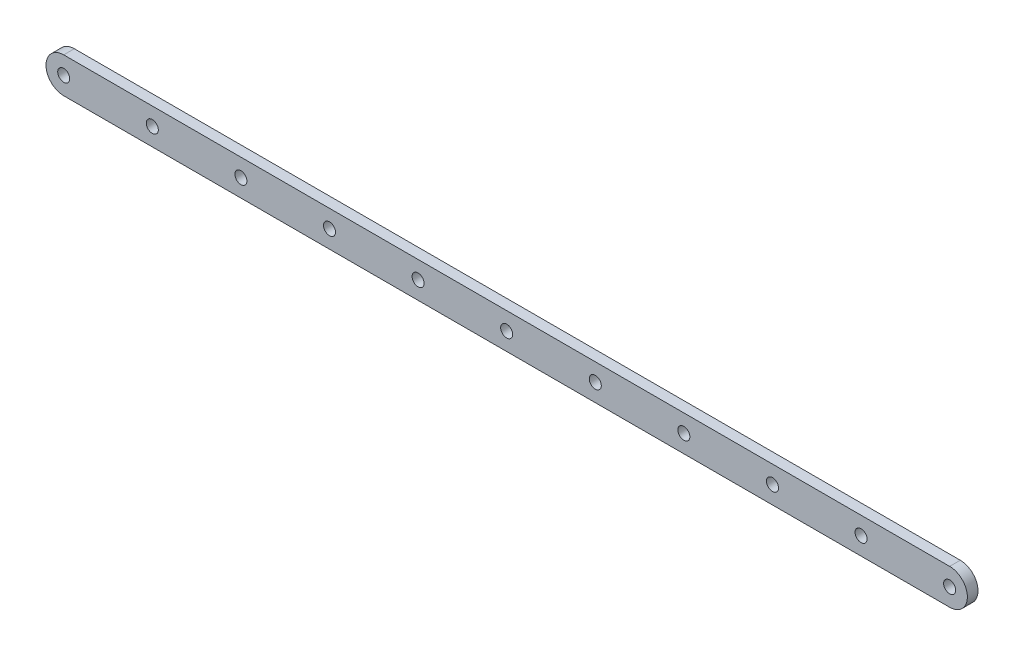
ISO-10303-21;
HEADER;
FILE_DESCRIPTION(('STEP AP214'),'2;1');
FILE_NAME('part.step','',(''),(''),'','','');
FILE_SCHEMA(('AUTOMOTIVE_DESIGN { 1 0 10303 214 1 1 1 1 }'));
ENDSEC;
DATA;
#1=APPLICATION_CONTEXT('core data for automotive mechanical design processes');
#2=APPLICATION_PROTOCOL_DEFINITION('international standard','automotive_design',2000,#1);
#3=PRODUCT_CONTEXT('',#1,'mechanical');
#4=PRODUCT('Part','Part','',(#3));
#5=PRODUCT_RELATED_PRODUCT_CATEGORY('part','',(#4));
#6=PRODUCT_DEFINITION_FORMATION('','',#4);
#7=PRODUCT_DEFINITION_CONTEXT('part definition',#1,'design');
#8=PRODUCT_DEFINITION('design','',#6,#7);
#9=PRODUCT_DEFINITION_SHAPE('','',#8);
#10=(LENGTH_UNIT() NAMED_UNIT(*) SI_UNIT(.MILLI.,.METRE.));
#11=(NAMED_UNIT(*) PLANE_ANGLE_UNIT() SI_UNIT($,.RADIAN.));
#12=(NAMED_UNIT(*) SI_UNIT($,.STERADIAN.) SOLID_ANGLE_UNIT());
#13=UNCERTAINTY_MEASURE_WITH_UNIT(LENGTH_MEASURE(1.E-05),#10,'distance_accuracy_value','');
#14=(GEOMETRIC_REPRESENTATION_CONTEXT(3) GLOBAL_UNCERTAINTY_ASSIGNED_CONTEXT((#13)) GLOBAL_UNIT_ASSIGNED_CONTEXT((#10,
#11,#12)) REPRESENTATION_CONTEXT('',''));
#15=CARTESIAN_POINT('',(0.,0.,0.));
#16=DIRECTION('',(0.,0.,1.));
#17=DIRECTION('',(1.,0.,0.));
#18=AXIS2_PLACEMENT_3D('',#15,#16,#17);
#19=CARTESIAN_POINT('',(0.,-5.,3.));
#20=DIRECTION('',(0.,-1.,0.));
#21=DIRECTION('',(1.,0.,0.));
#22=AXIS2_PLACEMENT_3D('',#19,#20,#21);
#23=PLANE('',#22);
#24=DIRECTION('',(-1.,0.,0.));
#25=VECTOR('',#24,1.);
#26=CARTESIAN_POINT('',(0.,-5.,0.));
#27=LINE('',#26,#25);
#28=CARTESIAN_POINT('',(250.,-5.,0.));
#29=VERTEX_POINT('',#28);
#30=CARTESIAN_POINT('',(0.,-5.,0.));
#31=VERTEX_POINT('',#30);
#32=EDGE_CURVE('E111',#29,#31,#27,.T.);
#33=ORIENTED_EDGE('',*,*,#32,.F.);
#34=DIRECTION('',(0.,0.,-1.));
#35=VECTOR('',#34,1.);
#36=CARTESIAN_POINT('',(250.,-5.,3.));
#37=LINE('',#36,#35);
#38=CARTESIAN_POINT('',(250.,-5.,3.));
#39=VERTEX_POINT('',#38);
#40=EDGE_CURVE('E11',#39,#29,#37,.T.);
#41=ORIENTED_EDGE('',*,*,#40,.F.);
#42=DIRECTION('',(-1.,0.,0.));
#43=VECTOR('',#42,1.);
#44=CARTESIAN_POINT('',(0.,-5.,3.));
#45=LINE('',#44,#43);
#46=CARTESIAN_POINT('',(0.,-5.,3.));
#47=VERTEX_POINT('',#46);
#48=EDGE_CURVE('E92',#39,#47,#45,.T.);
#49=ORIENTED_EDGE('',*,*,#48,.T.);
#50=DIRECTION('',(0.,0.,-1.));
#51=VECTOR('',#50,1.);
#52=CARTESIAN_POINT('',(0.,-5.,3.));
#53=LINE('',#52,#51);
#54=EDGE_CURVE('E82',#47,#31,#53,.T.);
#55=ORIENTED_EDGE('',*,*,#54,.T.);
#56=EDGE_LOOP('',(#33,#41,#49,#55));
#57=FACE_BOUND('',#56,.T.);
#58=ADVANCED_FACE('F43',(#57),#23,.T.);
#59=CARTESIAN_POINT('',(250.,0.,3.));
#60=DIRECTION('',(0.,0.,-1.));
#61=DIRECTION('',(-1.,0.,0.));
#62=AXIS2_PLACEMENT_3D('',#59,#60,#61);
#63=CYLINDRICAL_SURFACE('',#62,4.99999999999999);
#64=CARTESIAN_POINT('',(250.,0.,0.));
#65=DIRECTION('',(0.,0.,1.));
#66=DIRECTION('',(1.,0.,0.));
#67=AXIS2_PLACEMENT_3D('',#64,#65,#66);
#68=CIRCLE('',#67,4.99999999999999);
#69=CARTESIAN_POINT('',(250.,5.,0.));
#70=VERTEX_POINT('',#69);
#71=EDGE_CURVE('E99',#29,#70,#68,.T.);
#72=ORIENTED_EDGE('',*,*,#71,.T.);
#73=DIRECTION('',(0.,0.,-1.));
#74=VECTOR('',#73,1.);
#75=CARTESIAN_POINT('',(250.,5.,3.));
#76=LINE('',#75,#74);
#77=CARTESIAN_POINT('',(250.,5.,3.));
#78=VERTEX_POINT('',#77);
#79=EDGE_CURVE('E52',#78,#70,#76,.T.);
#80=ORIENTED_EDGE('',*,*,#79,.F.);
#81=CARTESIAN_POINT('',(250.,0.,3.));
#82=DIRECTION('',(0.,0.,1.));
#83=DIRECTION('',(1.,0.,0.));
#84=AXIS2_PLACEMENT_3D('',#81,#82,#83);
#85=CIRCLE('',#84,4.99999999999999);
#86=EDGE_CURVE('E87',#39,#78,#85,.T.);
#87=ORIENTED_EDGE('',*,*,#86,.F.);
#88=ORIENTED_EDGE('',*,*,#40,.T.);
#89=EDGE_LOOP('',(#72,#80,#87,#88));
#90=FACE_BOUND('',#89,.T.);
#91=ADVANCED_FACE('F97',(#90),#63,.T.);
#92=CARTESIAN_POINT('',(0.,5.,3.));
#93=DIRECTION('',(0.,1.,0.));
#94=DIRECTION('',(-1.,0.,0.));
#95=AXIS2_PLACEMENT_3D('',#92,#93,#94);
#96=PLANE('',#95);
#97=DIRECTION('',(1.,0.,0.));
#98=VECTOR('',#97,1.);
#99=CARTESIAN_POINT('',(0.,5.,0.));
#100=LINE('',#99,#98);
#101=CARTESIAN_POINT('',(0.,5.,0.));
#102=VERTEX_POINT('',#101);
#103=EDGE_CURVE('E118',#102,#70,#100,.T.);
#104=ORIENTED_EDGE('',*,*,#103,.F.);
#105=DIRECTION('',(0.,0.,-1.));
#106=VECTOR('',#105,1.);
#107=CARTESIAN_POINT('',(0.,5.,3.));
#108=LINE('',#107,#106);
#109=CARTESIAN_POINT('',(0.,5.,3.));
#110=VERTEX_POINT('',#109);
#111=EDGE_CURVE('E75',#110,#102,#108,.T.);
#112=ORIENTED_EDGE('',*,*,#111,.F.);
#113=DIRECTION('',(1.,0.,0.));
#114=VECTOR('',#113,1.);
#115=CARTESIAN_POINT('',(0.,5.,3.));
#116=LINE('',#115,#114);
#117=EDGE_CURVE('E91',#110,#78,#116,.T.);
#118=ORIENTED_EDGE('',*,*,#117,.T.);
#119=ORIENTED_EDGE('',*,*,#79,.T.);
#120=EDGE_LOOP('',(#104,#112,#118,#119));
#121=FACE_BOUND('',#120,.T.);
#122=ADVANCED_FACE('F104',(#121),#96,.T.);
#123=CARTESIAN_POINT('',(0.,0.,3.));
#124=DIRECTION('',(0.,0.,-1.));
#125=DIRECTION('',(-1.,0.,0.));
#126=AXIS2_PLACEMENT_3D('',#123,#124,#125);
#127=CYLINDRICAL_SURFACE('',#126,5.);
#128=CARTESIAN_POINT('',(0.,0.,0.));
#129=DIRECTION('',(0.,0.,1.));
#130=DIRECTION('',(1.,0.,0.));
#131=AXIS2_PLACEMENT_3D('',#128,#129,#130);
#132=CIRCLE('',#131,5.);
#133=EDGE_CURVE('E121',#102,#31,#132,.T.);
#134=ORIENTED_EDGE('',*,*,#133,.T.);
#135=ORIENTED_EDGE('',*,*,#54,.F.);
#136=CARTESIAN_POINT('',(0.,0.,3.));
#137=DIRECTION('',(0.,0.,1.));
#138=DIRECTION('',(1.,0.,0.));
#139=AXIS2_PLACEMENT_3D('',#136,#137,#138);
#140=CIRCLE('',#139,5.);
#141=EDGE_CURVE('E60',#110,#47,#140,.T.);
#142=ORIENTED_EDGE('',*,*,#141,.F.);
#143=ORIENTED_EDGE('',*,*,#111,.T.);
#144=EDGE_LOOP('',(#134,#135,#142,#143));
#145=FACE_BOUND('',#144,.T.);
#146=ADVANCED_FACE('F229',(#145),#127,.T.);
#147=CARTESIAN_POINT('',(0.,0.,3.));
#148=DIRECTION('',(0.,0.,1.));
#149=DIRECTION('',(1.,0.,0.));
#150=AXIS2_PLACEMENT_3D('',#147,#148,#149);
#151=PLANE('',#150);
#152=CARTESIAN_POINT('',(25.,0.,3.));
#153=DIRECTION('',(0.,0.,1.));
#154=DIRECTION('',(1.,0.,0.));
#155=AXIS2_PLACEMENT_3D('',#152,#153,#154);
#156=CIRCLE('',#155,1.7);
#157=CARTESIAN_POINT('',(26.7,0.,3.));
#158=VERTEX_POINT('',#157);
#159=EDGE_CURVE('E154',#158,#158,#156,.T.);
#160=ORIENTED_EDGE('',*,*,#159,.F.);
#161=EDGE_LOOP('',(#160));
#162=FACE_BOUND('',#161,.T.);
#163=CARTESIAN_POINT('',(175.,0.,3.));
#164=DIRECTION('',(0.,0.,1.));
#165=DIRECTION('',(1.,0.,0.));
#166=AXIS2_PLACEMENT_3D('',#163,#164,#165);
#167=CIRCLE('',#166,1.7);
#168=CARTESIAN_POINT('',(176.7,0.,3.));
#169=VERTEX_POINT('',#168);
#170=EDGE_CURVE('E187',#169,#169,#167,.T.);
#171=ORIENTED_EDGE('',*,*,#170,.F.);
#172=EDGE_LOOP('',(#171));
#173=FACE_BOUND('',#172,.T.);
#174=CARTESIAN_POINT('',(150.,0.,3.));
#175=DIRECTION('',(0.,0.,1.));
#176=DIRECTION('',(1.,0.,0.));
#177=AXIS2_PLACEMENT_3D('',#174,#175,#176);
#178=CIRCLE('',#177,1.7);
#179=CARTESIAN_POINT('',(151.7,0.,3.));
#180=VERTEX_POINT('',#179);
#181=EDGE_CURVE('E179',#180,#180,#178,.T.);
#182=ORIENTED_EDGE('',*,*,#181,.F.);
#183=EDGE_LOOP('',(#182));
#184=FACE_BOUND('',#183,.T.);
#185=CARTESIAN_POINT('',(225.,0.,3.));
#186=DIRECTION('',(0.,0.,1.));
#187=DIRECTION('',(1.,0.,0.));
#188=AXIS2_PLACEMENT_3D('',#185,#186,#187);
#189=CIRCLE('',#188,1.7);
#190=CARTESIAN_POINT('',(226.7,0.,3.));
#191=VERTEX_POINT('',#190);
#192=EDGE_CURVE('E203',#191,#191,#189,.T.);
#193=ORIENTED_EDGE('',*,*,#192,.F.);
#194=EDGE_LOOP('',(#193));
#195=FACE_BOUND('',#194,.T.);
#196=CARTESIAN_POINT('',(200.,0.,3.));
#197=DIRECTION('',(0.,0.,1.));
#198=DIRECTION('',(1.,0.,0.));
#199=AXIS2_PLACEMENT_3D('',#196,#197,#198);
#200=CIRCLE('',#199,1.7);
#201=CARTESIAN_POINT('',(201.7,0.,3.));
#202=VERTEX_POINT('',#201);
#203=EDGE_CURVE('E195',#202,#202,#200,.T.);
#204=ORIENTED_EDGE('',*,*,#203,.F.);
#205=EDGE_LOOP('',(#204));
#206=FACE_BOUND('',#205,.T.);
#207=CARTESIAN_POINT('',(75.,0.,3.));
#208=DIRECTION('',(0.,0.,1.));
#209=DIRECTION('',(1.,0.,0.));
#210=AXIS2_PLACEMENT_3D('',#207,#208,#209);
#211=CIRCLE('',#210,1.7);
#212=CARTESIAN_POINT('',(76.7,0.,3.));
#213=VERTEX_POINT('',#212);
#214=EDGE_CURVE('E155',#213,#213,#211,.T.);
#215=ORIENTED_EDGE('',*,*,#214,.F.);
#216=EDGE_LOOP('',(#215));
#217=FACE_BOUND('',#216,.T.);
#218=CARTESIAN_POINT('',(50.,0.,3.));
#219=DIRECTION('',(0.,0.,1.));
#220=DIRECTION('',(1.,0.,0.));
#221=AXIS2_PLACEMENT_3D('',#218,#219,#220);
#222=CIRCLE('',#221,1.7);
#223=CARTESIAN_POINT('',(51.7,0.,3.));
#224=VERTEX_POINT('',#223);
#225=EDGE_CURVE('E145',#224,#224,#222,.T.);
#226=ORIENTED_EDGE('',*,*,#225,.F.);
#227=EDGE_LOOP('',(#226));
#228=FACE_BOUND('',#227,.T.);
#229=CARTESIAN_POINT('',(125.,0.,3.));
#230=DIRECTION('',(0.,0.,1.));
#231=DIRECTION('',(1.,0.,0.));
#232=AXIS2_PLACEMENT_3D('',#229,#230,#231);
#233=CIRCLE('',#232,1.7);
#234=CARTESIAN_POINT('',(126.7,0.,3.));
#235=VERTEX_POINT('',#234);
#236=EDGE_CURVE('E171',#235,#235,#233,.T.);
#237=ORIENTED_EDGE('',*,*,#236,.F.);
#238=EDGE_LOOP('',(#237));
#239=FACE_BOUND('',#238,.T.);
#240=CARTESIAN_POINT('',(100.,0.,3.));
#241=DIRECTION('',(0.,0.,1.));
#242=DIRECTION('',(1.,0.,0.));
#243=AXIS2_PLACEMENT_3D('',#240,#241,#242);
#244=CIRCLE('',#243,1.7);
#245=CARTESIAN_POINT('',(101.7,0.,3.));
#246=VERTEX_POINT('',#245);
#247=EDGE_CURVE('E163',#246,#246,#244,.T.);
#248=ORIENTED_EDGE('',*,*,#247,.F.);
#249=EDGE_LOOP('',(#248));
#250=FACE_BOUND('',#249,.T.);
#251=CARTESIAN_POINT('',(0.,0.,3.));
#252=DIRECTION('',(0.,0.,1.));
#253=DIRECTION('',(1.,0.,0.));
#254=AXIS2_PLACEMENT_3D('',#251,#252,#253);
#255=CIRCLE('',#254,1.7);
#256=CARTESIAN_POINT('',(1.7,0.,3.));
#257=VERTEX_POINT('',#256);
#258=EDGE_CURVE('E138',#257,#257,#255,.T.);
#259=ORIENTED_EDGE('',*,*,#258,.F.);
#260=EDGE_LOOP('',(#259));
#261=FACE_BOUND('',#260,.T.);
#262=CARTESIAN_POINT('',(250.,0.,3.));
#263=DIRECTION('',(0.,0.,1.));
#264=DIRECTION('',(1.,0.,0.));
#265=AXIS2_PLACEMENT_3D('',#262,#263,#264);
#266=CIRCLE('',#265,1.69999999999996);
#267=CARTESIAN_POINT('',(251.7,0.,3.));
#268=VERTEX_POINT('',#267);
#269=EDGE_CURVE('E129',#268,#268,#266,.T.);
#270=ORIENTED_EDGE('',*,*,#269,.F.);
#271=EDGE_LOOP('',(#270));
#272=FACE_BOUND('',#271,.T.);
#273=ORIENTED_EDGE('',*,*,#48,.F.);
#274=ORIENTED_EDGE('',*,*,#86,.T.);
#275=ORIENTED_EDGE('',*,*,#117,.F.);
#276=ORIENTED_EDGE('',*,*,#141,.T.);
#277=EDGE_LOOP('',(#273,#274,#275,#276));
#278=FACE_BOUND('',#277,.T.);
#279=ADVANCED_FACE('F89',(#162,#173,#184,#195,#206,#217,#228,#239,#250,#261,#272,#278),#151,.T.);
#280=CARTESIAN_POINT('',(0.,0.,0.));
#281=DIRECTION('',(0.,0.,1.));
#282=DIRECTION('',(1.,0.,0.));
#283=AXIS2_PLACEMENT_3D('',#280,#281,#282);
#284=PLANE('',#283);
#285=CARTESIAN_POINT('',(25.,0.,0.));
#286=DIRECTION('',(0.,0.,1.));
#287=DIRECTION('',(1.,0.,0.));
#288=AXIS2_PLACEMENT_3D('',#285,#286,#287);
#289=CIRCLE('',#288,1.7);
#290=CARTESIAN_POINT('',(26.7,0.,0.));
#291=VERTEX_POINT('',#290);
#292=EDGE_CURVE('E134',#291,#291,#289,.T.);
#293=ORIENTED_EDGE('',*,*,#292,.T.);
#294=EDGE_LOOP('',(#293));
#295=FACE_BOUND('',#294,.T.);
#296=CARTESIAN_POINT('',(175.,0.,0.));
#297=DIRECTION('',(0.,0.,1.));
#298=DIRECTION('',(1.,0.,0.));
#299=AXIS2_PLACEMENT_3D('',#296,#297,#298);
#300=CIRCLE('',#299,1.7);
#301=CARTESIAN_POINT('',(176.7,0.,0.));
#302=VERTEX_POINT('',#301);
#303=EDGE_CURVE('E183',#302,#302,#300,.T.);
#304=ORIENTED_EDGE('',*,*,#303,.T.);
#305=EDGE_LOOP('',(#304));
#306=FACE_BOUND('',#305,.T.);
#307=CARTESIAN_POINT('',(150.,0.,0.));
#308=DIRECTION('',(0.,0.,1.));
#309=DIRECTION('',(1.,0.,0.));
#310=AXIS2_PLACEMENT_3D('',#307,#308,#309);
#311=CIRCLE('',#310,1.7);
#312=CARTESIAN_POINT('',(151.7,0.,0.));
#313=VERTEX_POINT('',#312);
#314=EDGE_CURVE('E175',#313,#313,#311,.T.);
#315=ORIENTED_EDGE('',*,*,#314,.T.);
#316=EDGE_LOOP('',(#315));
#317=FACE_BOUND('',#316,.T.);
#318=CARTESIAN_POINT('',(225.,0.,0.));
#319=DIRECTION('',(0.,0.,1.));
#320=DIRECTION('',(1.,0.,0.));
#321=AXIS2_PLACEMENT_3D('',#318,#319,#320);
#322=CIRCLE('',#321,1.7);
#323=CARTESIAN_POINT('',(226.7,0.,0.));
#324=VERTEX_POINT('',#323);
#325=EDGE_CURVE('E199',#324,#324,#322,.T.);
#326=ORIENTED_EDGE('',*,*,#325,.T.);
#327=EDGE_LOOP('',(#326));
#328=FACE_BOUND('',#327,.T.);
#329=CARTESIAN_POINT('',(200.,0.,0.));
#330=DIRECTION('',(0.,0.,1.));
#331=DIRECTION('',(1.,0.,0.));
#332=AXIS2_PLACEMENT_3D('',#329,#330,#331);
#333=CIRCLE('',#332,1.7);
#334=CARTESIAN_POINT('',(201.7,0.,0.));
#335=VERTEX_POINT('',#334);
#336=EDGE_CURVE('E191',#335,#335,#333,.T.);
#337=ORIENTED_EDGE('',*,*,#336,.T.);
#338=EDGE_LOOP('',(#337));
#339=FACE_BOUND('',#338,.T.);
#340=CARTESIAN_POINT('',(75.,0.,0.));
#341=DIRECTION('',(0.,0.,1.));
#342=DIRECTION('',(1.,0.,0.));
#343=AXIS2_PLACEMENT_3D('',#340,#341,#342);
#344=CIRCLE('',#343,1.7);
#345=CARTESIAN_POINT('',(76.7,0.,0.));
#346=VERTEX_POINT('',#345);
#347=EDGE_CURVE('E150',#346,#346,#344,.T.);
#348=ORIENTED_EDGE('',*,*,#347,.T.);
#349=EDGE_LOOP('',(#348));
#350=FACE_BOUND('',#349,.T.);
#351=CARTESIAN_POINT('',(50.,0.,0.));
#352=DIRECTION('',(0.,0.,1.));
#353=DIRECTION('',(1.,0.,0.));
#354=AXIS2_PLACEMENT_3D('',#351,#352,#353);
#355=CIRCLE('',#354,1.7);
#356=CARTESIAN_POINT('',(51.7,0.,0.));
#357=VERTEX_POINT('',#356);
#358=EDGE_CURVE('E149',#357,#357,#355,.T.);
#359=ORIENTED_EDGE('',*,*,#358,.T.);
#360=EDGE_LOOP('',(#359));
#361=FACE_BOUND('',#360,.T.);
#362=CARTESIAN_POINT('',(125.,0.,0.));
#363=DIRECTION('',(0.,0.,1.));
#364=DIRECTION('',(1.,0.,0.));
#365=AXIS2_PLACEMENT_3D('',#362,#363,#364);
#366=CIRCLE('',#365,1.7);
#367=CARTESIAN_POINT('',(126.7,0.,0.));
#368=VERTEX_POINT('',#367);
#369=EDGE_CURVE('E167',#368,#368,#366,.T.);
#370=ORIENTED_EDGE('',*,*,#369,.T.);
#371=EDGE_LOOP('',(#370));
#372=FACE_BOUND('',#371,.T.);
#373=CARTESIAN_POINT('',(100.,0.,0.));
#374=DIRECTION('',(0.,0.,1.));
#375=DIRECTION('',(1.,0.,0.));
#376=AXIS2_PLACEMENT_3D('',#373,#374,#375);
#377=CIRCLE('',#376,1.7);
#378=CARTESIAN_POINT('',(101.7,0.,0.));
#379=VERTEX_POINT('',#378);
#380=EDGE_CURVE('E159',#379,#379,#377,.T.);
#381=ORIENTED_EDGE('',*,*,#380,.T.);
#382=EDGE_LOOP('',(#381));
#383=FACE_BOUND('',#382,.T.);
#384=CARTESIAN_POINT('',(0.,0.,0.));
#385=DIRECTION('',(0.,0.,1.));
#386=DIRECTION('',(1.,0.,0.));
#387=AXIS2_PLACEMENT_3D('',#384,#385,#386);
#388=CIRCLE('',#387,1.7);
#389=CARTESIAN_POINT('',(1.7,0.,0.));
#390=VERTEX_POINT('',#389);
#391=EDGE_CURVE('E115',#390,#390,#388,.T.);
#392=ORIENTED_EDGE('',*,*,#391,.T.);
#393=EDGE_LOOP('',(#392));
#394=FACE_BOUND('',#393,.T.);
#395=CARTESIAN_POINT('',(250.,0.,0.));
#396=DIRECTION('',(0.,0.,1.));
#397=DIRECTION('',(1.,0.,0.));
#398=AXIS2_PLACEMENT_3D('',#395,#396,#397);
#399=CIRCLE('',#398,1.69999999999996);
#400=CARTESIAN_POINT('',(251.7,0.,0.));
#401=VERTEX_POINT('',#400);
#402=EDGE_CURVE('E133',#401,#401,#399,.T.);
#403=ORIENTED_EDGE('',*,*,#402,.T.);
#404=EDGE_LOOP('',(#403));
#405=FACE_BOUND('',#404,.T.);
#406=ORIENTED_EDGE('',*,*,#32,.T.);
#407=ORIENTED_EDGE('',*,*,#133,.F.);
#408=ORIENTED_EDGE('',*,*,#103,.T.);
#409=ORIENTED_EDGE('',*,*,#71,.F.);
#410=EDGE_LOOP('',(#406,#407,#408,#409));
#411=FACE_BOUND('',#410,.T.);
#412=ADVANCED_FACE('F217',(#295,#306,#317,#328,#339,#350,#361,#372,#383,#394,#405,#411),#284,.F.);
#413=CARTESIAN_POINT('',(250.,0.,0.));
#414=DIRECTION('',(0.,0.,1.));
#415=DIRECTION('',(1.,0.,0.));
#416=AXIS2_PLACEMENT_3D('',#413,#414,#415);
#417=CYLINDRICAL_SURFACE('',#416,1.69999999999996);
#418=ORIENTED_EDGE('',*,*,#402,.F.);
#419=EDGE_LOOP('',(#418));
#420=FACE_BOUND('',#419,.T.);
#421=ORIENTED_EDGE('',*,*,#269,.T.);
#422=EDGE_LOOP('',(#421));
#423=FACE_BOUND('',#422,.T.);
#424=ADVANCED_FACE('F251',(#420,#423),#417,.F.);
#425=CARTESIAN_POINT('',(0.,0.,0.));
#426=DIRECTION('',(0.,0.,1.));
#427=DIRECTION('',(1.,0.,0.));
#428=AXIS2_PLACEMENT_3D('',#425,#426,#427);
#429=CYLINDRICAL_SURFACE('',#428,1.7);
#430=ORIENTED_EDGE('',*,*,#391,.F.);
#431=EDGE_LOOP('',(#430));
#432=FACE_BOUND('',#431,.T.);
#433=ORIENTED_EDGE('',*,*,#258,.T.);
#434=EDGE_LOOP('',(#433));
#435=FACE_BOUND('',#434,.T.);
#436=ADVANCED_FACE('F253',(#432,#435),#429,.F.);
#437=CARTESIAN_POINT('',(100.,0.,0.));
#438=DIRECTION('',(0.,0.,1.));
#439=DIRECTION('',(1.,0.,0.));
#440=AXIS2_PLACEMENT_3D('',#437,#438,#439);
#441=CYLINDRICAL_SURFACE('',#440,1.7);
#442=ORIENTED_EDGE('',*,*,#380,.F.);
#443=EDGE_LOOP('',(#442));
#444=FACE_BOUND('',#443,.T.);
#445=ORIENTED_EDGE('',*,*,#247,.T.);
#446=EDGE_LOOP('',(#445));
#447=FACE_BOUND('',#446,.T.);
#448=ADVANCED_FACE('F260',(#444,#447),#441,.F.);
#449=CARTESIAN_POINT('',(125.,0.,0.));
#450=DIRECTION('',(0.,0.,1.));
#451=DIRECTION('',(1.,0.,0.));
#452=AXIS2_PLACEMENT_3D('',#449,#450,#451);
#453=CYLINDRICAL_SURFACE('',#452,1.7);
#454=ORIENTED_EDGE('',*,*,#369,.F.);
#455=EDGE_LOOP('',(#454));
#456=FACE_BOUND('',#455,.T.);
#457=ORIENTED_EDGE('',*,*,#236,.T.);
#458=EDGE_LOOP('',(#457));
#459=FACE_BOUND('',#458,.T.);
#460=ADVANCED_FACE('F300',(#456,#459),#453,.F.);
#461=CARTESIAN_POINT('',(50.,0.,0.));
#462=DIRECTION('',(0.,0.,1.));
#463=DIRECTION('',(1.,0.,0.));
#464=AXIS2_PLACEMENT_3D('',#461,#462,#463);
#465=CYLINDRICAL_SURFACE('',#464,1.7);
#466=ORIENTED_EDGE('',*,*,#358,.F.);
#467=EDGE_LOOP('',(#466));
#468=FACE_BOUND('',#467,.T.);
#469=ORIENTED_EDGE('',*,*,#225,.T.);
#470=EDGE_LOOP('',(#469));
#471=FACE_BOUND('',#470,.T.);
#472=ADVANCED_FACE('F311',(#468,#471),#465,.F.);
#473=CARTESIAN_POINT('',(75.,0.,0.));
#474=DIRECTION('',(0.,0.,1.));
#475=DIRECTION('',(1.,0.,0.));
#476=AXIS2_PLACEMENT_3D('',#473,#474,#475);
#477=CYLINDRICAL_SURFACE('',#476,1.7);
#478=ORIENTED_EDGE('',*,*,#347,.F.);
#479=EDGE_LOOP('',(#478));
#480=FACE_BOUND('',#479,.T.);
#481=ORIENTED_EDGE('',*,*,#214,.T.);
#482=EDGE_LOOP('',(#481));
#483=FACE_BOUND('',#482,.T.);
#484=ADVANCED_FACE('F321',(#480,#483),#477,.F.);
#485=CARTESIAN_POINT('',(200.,0.,0.));
#486=DIRECTION('',(0.,0.,1.));
#487=DIRECTION('',(1.,0.,0.));
#488=AXIS2_PLACEMENT_3D('',#485,#486,#487);
#489=CYLINDRICAL_SURFACE('',#488,1.7);
#490=ORIENTED_EDGE('',*,*,#336,.F.);
#491=EDGE_LOOP('',(#490));
#492=FACE_BOUND('',#491,.T.);
#493=ORIENTED_EDGE('',*,*,#203,.T.);
#494=EDGE_LOOP('',(#493));
#495=FACE_BOUND('',#494,.T.);
#496=ADVANCED_FACE('F331',(#492,#495),#489,.F.);
#497=CARTESIAN_POINT('',(225.,0.,0.));
#498=DIRECTION('',(0.,0.,1.));
#499=DIRECTION('',(1.,0.,0.));
#500=AXIS2_PLACEMENT_3D('',#497,#498,#499);
#501=CYLINDRICAL_SURFACE('',#500,1.7);
#502=ORIENTED_EDGE('',*,*,#325,.F.);
#503=EDGE_LOOP('',(#502));
#504=FACE_BOUND('',#503,.T.);
#505=ORIENTED_EDGE('',*,*,#192,.T.);
#506=EDGE_LOOP('',(#505));
#507=FACE_BOUND('',#506,.T.);
#508=ADVANCED_FACE('F341',(#504,#507),#501,.F.);
#509=CARTESIAN_POINT('',(150.,0.,0.));
#510=DIRECTION('',(0.,0.,1.));
#511=DIRECTION('',(1.,0.,0.));
#512=AXIS2_PLACEMENT_3D('',#509,#510,#511);
#513=CYLINDRICAL_SURFACE('',#512,1.7);
#514=ORIENTED_EDGE('',*,*,#314,.F.);
#515=EDGE_LOOP('',(#514));
#516=FACE_BOUND('',#515,.T.);
#517=ORIENTED_EDGE('',*,*,#181,.T.);
#518=EDGE_LOOP('',(#517));
#519=FACE_BOUND('',#518,.T.);
#520=ADVANCED_FACE('F351',(#516,#519),#513,.F.);
#521=CARTESIAN_POINT('',(175.,0.,0.));
#522=DIRECTION('',(0.,0.,1.));
#523=DIRECTION('',(1.,0.,0.));
#524=AXIS2_PLACEMENT_3D('',#521,#522,#523);
#525=CYLINDRICAL_SURFACE('',#524,1.7);
#526=ORIENTED_EDGE('',*,*,#303,.F.);
#527=EDGE_LOOP('',(#526));
#528=FACE_BOUND('',#527,.T.);
#529=ORIENTED_EDGE('',*,*,#170,.T.);
#530=EDGE_LOOP('',(#529));
#531=FACE_BOUND('',#530,.T.);
#532=ADVANCED_FACE('F223',(#528,#531),#525,.F.);
#533=CARTESIAN_POINT('',(25.,0.,0.));
#534=DIRECTION('',(0.,0.,1.));
#535=DIRECTION('',(1.,0.,0.));
#536=AXIS2_PLACEMENT_3D('',#533,#534,#535);
#537=CYLINDRICAL_SURFACE('',#536,1.7);
#538=ORIENTED_EDGE('',*,*,#292,.F.);
#539=EDGE_LOOP('',(#538));
#540=FACE_BOUND('',#539,.T.);
#541=ORIENTED_EDGE('',*,*,#159,.T.);
#542=EDGE_LOOP('',(#541));
#543=FACE_BOUND('',#542,.T.);
#544=ADVANCED_FACE('F220',(#540,#543),#537,.F.);
#545=CLOSED_SHELL('',(#58,#91,#122,#146,#279,#412,#424,#436,#448,#460,#472,#484,#496,#508,#520,
#532,#544));
#546=MANIFOLD_SOLID_BREP('B2',#545);
#547=ADVANCED_BREP_SHAPE_REPRESENTATION('',(#18,#546),#14);
#548=SHAPE_DEFINITION_REPRESENTATION(#9,#547);
ENDSEC;
END-ISO-10303-21;
